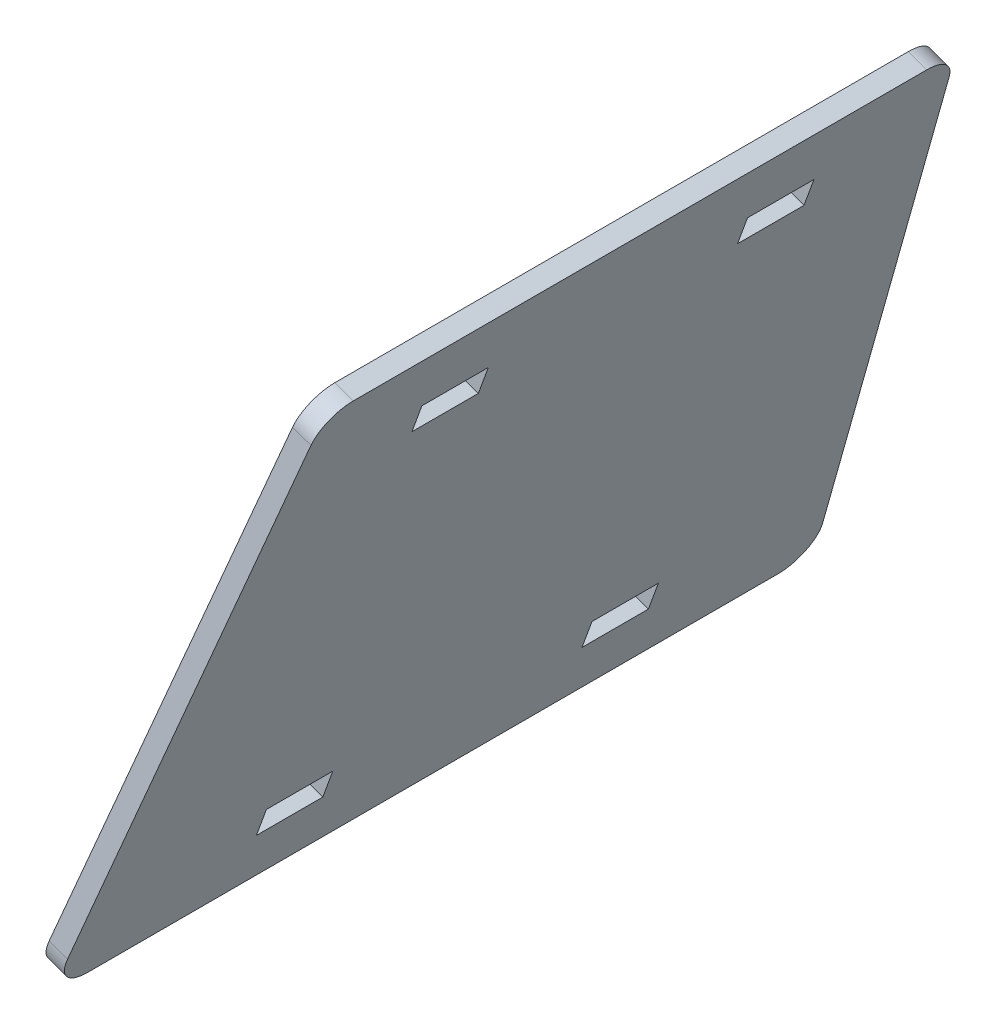
ISO-10303-21;
HEADER;
FILE_DESCRIPTION(('STEP AP214'),'2;1');
FILE_NAME('part.step','',(''),(''),'','','');
FILE_SCHEMA(('AUTOMOTIVE_DESIGN { 1 0 10303 214 1 1 1 1 }'));
ENDSEC;
DATA;
#1=APPLICATION_CONTEXT('core data for automotive mechanical design processes');
#2=APPLICATION_PROTOCOL_DEFINITION('international standard','automotive_design',2000,#1);
#3=PRODUCT_CONTEXT('',#1,'mechanical');
#4=PRODUCT('Part','Part','',(#3));
#5=PRODUCT_RELATED_PRODUCT_CATEGORY('part','',(#4));
#6=PRODUCT_DEFINITION_FORMATION('','',#4);
#7=PRODUCT_DEFINITION_CONTEXT('part definition',#1,'design');
#8=PRODUCT_DEFINITION('design','',#6,#7);
#9=PRODUCT_DEFINITION_SHAPE('','',#8);
#10=(LENGTH_UNIT() NAMED_UNIT(*) SI_UNIT(.MILLI.,.METRE.));
#11=(NAMED_UNIT(*) PLANE_ANGLE_UNIT() SI_UNIT($,.RADIAN.));
#12=(NAMED_UNIT(*) SI_UNIT($,.STERADIAN.) SOLID_ANGLE_UNIT());
#13=UNCERTAINTY_MEASURE_WITH_UNIT(LENGTH_MEASURE(1.E-05),#10,'distance_accuracy_value','');
#14=(GEOMETRIC_REPRESENTATION_CONTEXT(3) GLOBAL_UNCERTAINTY_ASSIGNED_CONTEXT((#13)) GLOBAL_UNIT_ASSIGNED_CONTEXT((#10,
#11,#12)) REPRESENTATION_CONTEXT('',''));
#15=CARTESIAN_POINT('',(0.,0.,0.));
#16=DIRECTION('',(0.,0.,1.));
#17=DIRECTION('',(1.,0.,0.));
#18=AXIS2_PLACEMENT_3D('',#15,#16,#17);
#19=CARTESIAN_POINT('',(-37.2681310039553,206.317493290376,-49.));
#20=DIRECTION('',(0.0367385989462375,0.100938471027188,-0.994214111956857));
#21=DIRECTION('',(0.,0.994885749576172,0.101006659633206));
#22=AXIS2_PLACEMENT_3D('',#19,#20,#21);
#23=PLANE('',#22);
#24=DIRECTION('',(0.340041253067883,0.934255664487075,0.107416477254837));
#25=VECTOR('',#24,1.);
#26=CARTESIAN_POINT('',(-65.3665086389558,216.544466380687,-49.));
#27=LINE('',#26,#25);
#28=CARTESIAN_POINT('',(-93.76563466198,138.518508900181,-57.9710705597843));
#29=VERTEX_POINT('',#28);
#30=CARTESIAN_POINT('',(-65.3665086389558,216.544466380687,-49.));
#31=VERTEX_POINT('',#30);
#32=EDGE_CURVE('E346',#29,#31,#27,.T.);
#33=ORIENTED_EDGE('',*,*,#32,.F.);
#34=DIRECTION('',(-0.93969262078591,0.342020143325665,0.));
#35=VECTOR('',#34,1.);
#36=CARTESIAN_POINT('',(-65.6672570269796,128.29153580987,-57.9710705597843));
#37=LINE('',#36,#35);
#38=CARTESIAN_POINT('',(-96.5847125243379,139.544569330158,-57.9710705597843));
#39=VERTEX_POINT('',#38);
#40=EDGE_CURVE('E361',#29,#39,#37,.T.);
#41=ORIENTED_EDGE('',*,*,#40,.T.);
#42=DIRECTION('',(-0.340041253067883,-0.934255664487075,-0.107416477254837));
#43=VECTOR('',#42,1.);
#44=CARTESIAN_POINT('',(-68.1855865013136,217.570526810664,-49.));
#45=LINE('',#44,#43);
#46=CARTESIAN_POINT('',(-68.1855865013136,217.570526810664,-49.));
#47=VERTEX_POINT('',#46);
#48=EDGE_CURVE('E333',#47,#39,#45,.T.);
#49=ORIENTED_EDGE('',*,*,#48,.F.);
#50=DIRECTION('',(-0.93969262078591,0.342020143325665,0.));
#51=VECTOR('',#50,1.);
#52=CARTESIAN_POINT('',(-37.2681310039553,206.317493290376,-49.));
#53=LINE('',#52,#51);
#54=EDGE_CURVE('E343',#31,#47,#53,.T.);
#55=ORIENTED_EDGE('',*,*,#54,.F.);
#56=EDGE_LOOP('',(#33,#41,#49,#55));
#57=FACE_BOUND('',#56,.T.);
#58=ADVANCED_FACE('F31',(#57),#23,.T.);
#59=CARTESIAN_POINT('',(-65.8509500217108,127.786843454734,-53.));
#60=DIRECTION('',(-0.93969262078591,0.342020143325665,0.));
#61=DIRECTION('',(-0.342020143325665,-0.93969262078591,0.));
#62=AXIS2_PLACEMENT_3D('',#59,#60,#61);
#63=CYLINDRICAL_SURFACE('',#62,5.);
#64=ORIENTED_EDGE('',*,*,#40,.F.);
#65=CARTESIAN_POINT('',(-93.9493276567112,138.013816545045,-53.));
#66=DIRECTION('',(-0.93969262078591,0.342020143325665,0.));
#67=DIRECTION('',(-0.342020143325665,-0.93969262078591,0.));
#68=AXIS2_PLACEMENT_3D('',#65,#66,#67);
#69=CIRCLE('',#68,5.);
#70=CARTESIAN_POINT('',(-95.6594283733396,133.315353441115,-53.));
#71=VERTEX_POINT('',#70);
#72=EDGE_CURVE('E321',#71,#29,#69,.F.);
#73=ORIENTED_EDGE('',*,*,#72,.F.);
#74=DIRECTION('',(-0.93969262078591,0.342020143325665,0.));
#75=VECTOR('',#74,1.);
#76=CARTESIAN_POINT('',(-67.5610507383391,123.088380350804,-53.));
#77=LINE('',#76,#75);
#78=CARTESIAN_POINT('',(-98.4785062356973,134.341413871092,-53.));
#79=VERTEX_POINT('',#78);
#80=EDGE_CURVE('E358',#71,#79,#77,.T.);
#81=ORIENTED_EDGE('',*,*,#80,.T.);
#82=CARTESIAN_POINT('',(-96.768405519069,139.039876975022,-53.));
#83=DIRECTION('',(-0.93969262078591,0.342020143325665,0.));
#84=DIRECTION('',(-0.342020143325665,-0.93969262078591,0.));
#85=AXIS2_PLACEMENT_3D('',#82,#83,#84);
#86=CIRCLE('',#85,5.);
#87=EDGE_CURVE('E335',#39,#79,#86,.T.);
#88=ORIENTED_EDGE('',*,*,#87,.F.);
#89=EDGE_LOOP('',(#64,#73,#81,#88));
#90=FACE_BOUND('',#89,.T.);
#91=ADVANCED_FACE('F384',(#90),#63,.T.);
#92=CARTESIAN_POINT('',(-37.4518239986865,205.81280093524,-44.0289294402157));
#93=DIRECTION('',(-0.93969262078591,0.342020143325665,0.));
#94=DIRECTION('',(-0.342020143325665,-0.93969262078591,0.));
#95=AXIS2_PLACEMENT_3D('',#92,#93,#94);
#96=CYLINDRICAL_SURFACE('',#95,4.99999999999998);
#97=CARTESIAN_POINT('',(-65.550201633687,216.039774025551,-44.0289294402157));
#98=DIRECTION('',(-0.93969262078591,0.342020143325665,0.));
#99=DIRECTION('',(-0.342020143325665,-0.93969262078591,0.));
#100=AXIS2_PLACEMENT_3D('',#97,#98,#99);
#101=CIRCLE('',#100,4.99999999999998);
#102=CARTESIAN_POINT('',(-63.8401009170587,220.738237129481,-44.0289294402157));
#103=VERTEX_POINT('',#102);
#104=EDGE_CURVE('E323',#31,#103,#101,.F.);
#105=ORIENTED_EDGE('',*,*,#104,.F.);
#106=ORIENTED_EDGE('',*,*,#54,.T.);
#107=CARTESIAN_POINT('',(-68.3692794960448,217.065834455528,-44.0289294402157));
#108=DIRECTION('',(-0.93969262078591,0.342020143325665,0.));
#109=DIRECTION('',(-0.342020143325665,-0.93969262078591,0.));
#110=AXIS2_PLACEMENT_3D('',#107,#108,#109);
#111=CIRCLE('',#110,4.99999999999998);
#112=CARTESIAN_POINT('',(-66.6591787794165,221.764297559458,-44.0289294402157));
#113=VERTEX_POINT('',#112);
#114=EDGE_CURVE('E331',#113,#47,#111,.T.);
#115=ORIENTED_EDGE('',*,*,#114,.F.);
#116=DIRECTION('',(-0.93969262078591,0.342020143325665,0.));
#117=VECTOR('',#116,1.);
#118=CARTESIAN_POINT('',(-35.7417232820582,210.51126403917,-44.0289294402157));
#119=LINE('',#118,#117);
#120=EDGE_CURVE('E344',#103,#113,#119,.T.);
#121=ORIENTED_EDGE('',*,*,#120,.F.);
#122=EDGE_LOOP('',(#105,#106,#115,#121));
#123=FACE_BOUND('',#122,.T.);
#124=ADVANCED_FACE('F394',(#123),#96,.T.);
#125=CARTESIAN_POINT('',(-66.6591787794165,221.764297559458,58.));
#126=DIRECTION('',(-0.342020143325667,-0.939692620785909,0.));
#127=DIRECTION('',(0.939692620785909,-0.342020143325667,0.));
#128=AXIS2_PLACEMENT_3D('',#125,#126,#127);
#129=PLANE('',#128);
#130=DIRECTION('',(0.,0.,-1.));
#131=VECTOR('',#130,1.);
#132=CARTESIAN_POINT('',(-63.8401009170587,220.738237129481,58.));
#133=LINE('',#132,#131);
#134=CARTESIAN_POINT('',(-63.8401009170587,220.738237129481,44.0289294402157));
#135=VERTEX_POINT('',#134);
#136=EDGE_CURVE('E367',#135,#103,#133,.T.);
#137=ORIENTED_EDGE('',*,*,#136,.T.);
#138=ORIENTED_EDGE('',*,*,#120,.T.);
#139=DIRECTION('',(0.,0.,-1.));
#140=VECTOR('',#139,1.);
#141=CARTESIAN_POINT('',(-66.6591787794165,221.764297559458,58.));
#142=LINE('',#141,#140);
#143=CARTESIAN_POINT('',(-66.6591787794165,221.764297559458,44.0289294402157));
#144=VERTEX_POINT('',#143);
#145=EDGE_CURVE('E11',#144,#113,#142,.T.);
#146=ORIENTED_EDGE('',*,*,#145,.F.);
#147=DIRECTION('',(-0.93969262078591,0.342020143325665,0.));
#148=VECTOR('',#147,1.);
#149=CARTESIAN_POINT('',(-35.7417232820582,210.51126403917,44.0289294402157));
#150=LINE('',#149,#148);
#151=EDGE_CURVE('E347',#135,#144,#150,.T.);
#152=ORIENTED_EDGE('',*,*,#151,.F.);
#153=EDGE_LOOP('',(#137,#138,#146,#152));
#154=FACE_BOUND('',#153,.T.);
#155=ADVANCED_FACE('F33',(#154),#129,.F.);
#156=CARTESIAN_POINT('',(-95.6594283733396,133.315353441115,58.));
#157=DIRECTION('',(0.342020143325657,0.939692620785913,0.));
#158=DIRECTION('',(-0.939692620785913,0.342020143325657,0.));
#159=AXIS2_PLACEMENT_3D('',#156,#157,#158);
#160=PLANE('',#159);
#161=DIRECTION('',(0.,0.,-1.));
#162=VECTOR('',#161,1.);
#163=CARTESIAN_POINT('',(-95.6594283733396,133.315353441115,58.));
#164=LINE('',#163,#162);
#165=CARTESIAN_POINT('',(-95.6594283733396,133.315353441115,53.));
#166=VERTEX_POINT('',#165);
#167=EDGE_CURVE('E370',#166,#71,#164,.T.);
#168=ORIENTED_EDGE('',*,*,#167,.F.);
#169=DIRECTION('',(-0.93969262078591,0.342020143325665,0.));
#170=VECTOR('',#169,1.);
#171=CARTESIAN_POINT('',(-67.5610507383391,123.088380350804,53.));
#172=LINE('',#171,#170);
#173=CARTESIAN_POINT('',(-98.4785062356973,134.341413871092,53.));
#174=VERTEX_POINT('',#173);
#175=EDGE_CURVE('E356',#166,#174,#172,.T.);
#176=ORIENTED_EDGE('',*,*,#175,.T.);
#177=DIRECTION('',(0.,0.,-1.));
#178=VECTOR('',#177,1.);
#179=CARTESIAN_POINT('',(-98.4785062356973,134.341413871092,58.));
#180=LINE('',#179,#178);
#181=EDGE_CURVE('E39',#174,#79,#180,.T.);
#182=ORIENTED_EDGE('',*,*,#181,.T.);
#183=ORIENTED_EDGE('',*,*,#80,.F.);
#184=EDGE_LOOP('',(#168,#176,#182,#183));
#185=FACE_BOUND('',#184,.T.);
#186=ADVANCED_FACE('F376',(#185),#160,.F.);
#187=CARTESIAN_POINT('',(-98.4785062356973,134.341413871092,58.));
#188=DIRECTION('',(0.93969262078591,-0.342020143325665,0.));
#189=DIRECTION('',(0.342020143325665,0.93969262078591,0.));
#190=AXIS2_PLACEMENT_3D('',#187,#188,#189);
#191=PLANE('',#190);
#192=DIRECTION('',(-0.342020143325665,-0.93969262078591,0.));
#193=VECTOR('',#192,1.);
#194=CARTESIAN_POINT('',(-93.9321920853096,146.83230934103,19.9));
#195=LINE('',#194,#193);
#196=CARTESIAN_POINT('',(-93.9321920853096,146.83230934103,19.9));
#197=VERTEX_POINT('',#196);
#198=CARTESIAN_POINT('',(-95.4659622718433,142.618310386896,19.9));
#199=VERTEX_POINT('',#198);
#200=EDGE_CURVE('E214',#197,#199,#195,.T.);
#201=ORIENTED_EDGE('',*,*,#200,.F.);
#202=DIRECTION('',(0.,0.,-1.));
#203=VECTOR('',#202,1.);
#204=CARTESIAN_POINT('',(-93.9321920853096,146.83230934103,30.1));
#205=LINE('',#204,#203);
#206=CARTESIAN_POINT('',(-93.9321920853096,146.83230934103,30.1));
#207=VERTEX_POINT('',#206);
#208=EDGE_CURVE('E46',#207,#197,#205,.T.);
#209=ORIENTED_EDGE('',*,*,#208,.F.);
#210=DIRECTION('',(0.342020143325665,0.93969262078591,0.));
#211=VECTOR('',#210,1.);
#212=CARTESIAN_POINT('',(-93.9321920853096,146.83230934103,30.1));
#213=LINE('',#212,#211);
#214=CARTESIAN_POINT('',(-95.4659622718433,142.618310386896,30.1));
#215=VERTEX_POINT('',#214);
#216=EDGE_CURVE('E200',#215,#207,#213,.T.);
#217=ORIENTED_EDGE('',*,*,#216,.F.);
#218=DIRECTION('',(0.,0.,1.));
#219=VECTOR('',#218,1.);
#220=CARTESIAN_POINT('',(-95.4659622718433,142.618310386896,30.1));
#221=LINE('',#220,#219);
#222=EDGE_CURVE('E220',#199,#215,#221,.T.);
#223=ORIENTED_EDGE('',*,*,#222,.F.);
#224=EDGE_LOOP('',(#201,#209,#217,#223));
#225=FACE_BOUND('',#224,.T.);
#226=DIRECTION('',(-0.342020143325665,-0.93969262078591,0.));
#227=VECTOR('',#226,1.);
#228=CARTESIAN_POINT('',(-70.0451781983406,212.461340613677,19.9));
#229=LINE('',#228,#227);
#230=CARTESIAN_POINT('',(-70.0451781983406,212.461340613677,19.9));
#231=VERTEX_POINT('',#230);
#232=CARTESIAN_POINT('',(-71.5789483848743,208.247341659543,19.9));
#233=VERTEX_POINT('',#232);
#234=EDGE_CURVE('E238',#231,#233,#229,.T.);
#235=ORIENTED_EDGE('',*,*,#234,.F.);
#236=DIRECTION('',(0.,0.,-1.));
#237=VECTOR('',#236,1.);
#238=CARTESIAN_POINT('',(-70.0451781983406,212.461340613677,30.1));
#239=LINE('',#238,#237);
#240=CARTESIAN_POINT('',(-70.0451781983406,212.461340613677,30.1));
#241=VERTEX_POINT('',#240);
#242=EDGE_CURVE('E236',#241,#231,#239,.T.);
#243=ORIENTED_EDGE('',*,*,#242,.F.);
#244=DIRECTION('',(0.342020143325665,0.93969262078591,0.));
#245=VECTOR('',#244,1.);
#246=CARTESIAN_POINT('',(-70.0451781983406,212.461340613677,30.1));
#247=LINE('',#246,#245);
#248=CARTESIAN_POINT('',(-71.5789483848743,208.247341659543,30.1));
#249=VERTEX_POINT('',#248);
#250=EDGE_CURVE('E244',#249,#241,#247,.T.);
#251=ORIENTED_EDGE('',*,*,#250,.F.);
#252=DIRECTION('',(0.,0.,1.));
#253=VECTOR('',#252,1.);
#254=CARTESIAN_POINT('',(-71.5789483848743,208.247341659543,30.1));
#255=LINE('',#254,#253);
#256=EDGE_CURVE('E241',#233,#249,#255,.T.);
#257=ORIENTED_EDGE('',*,*,#256,.F.);
#258=EDGE_LOOP('',(#235,#243,#251,#257));
#259=FACE_BOUND('',#258,.T.);
#260=DIRECTION('',(0.,0.,1.));
#261=VECTOR('',#260,1.);
#262=CARTESIAN_POINT('',(-95.4659622718433,142.618310386896,-30.1));
#263=LINE('',#262,#261);
#264=CARTESIAN_POINT('',(-95.4659622718433,142.618310386896,-30.1));
#265=VERTEX_POINT('',#264);
#266=CARTESIAN_POINT('',(-95.4659622718433,142.618310386896,-19.9));
#267=VERTEX_POINT('',#266);
#268=EDGE_CURVE('E269',#265,#267,#263,.T.);
#269=ORIENTED_EDGE('',*,*,#268,.F.);
#270=DIRECTION('',(-0.342020143325665,-0.93969262078591,0.));
#271=VECTOR('',#270,1.);
#272=CARTESIAN_POINT('',(-93.9321920853096,146.83230934103,-30.1));
#273=LINE('',#272,#271);
#274=CARTESIAN_POINT('',(-93.9321920853096,146.83230934103,-30.1));
#275=VERTEX_POINT('',#274);
#276=EDGE_CURVE('E267',#275,#265,#273,.T.);
#277=ORIENTED_EDGE('',*,*,#276,.F.);
#278=DIRECTION('',(0.,0.,-1.));
#279=VECTOR('',#278,1.);
#280=CARTESIAN_POINT('',(-93.9321920853096,146.83230934103,-30.1));
#281=LINE('',#280,#279);
#282=CARTESIAN_POINT('',(-93.9321920853096,146.83230934103,-19.9));
#283=VERTEX_POINT('',#282);
#284=EDGE_CURVE('E275',#283,#275,#281,.T.);
#285=ORIENTED_EDGE('',*,*,#284,.F.);
#286=DIRECTION('',(0.342020143325665,0.93969262078591,0.));
#287=VECTOR('',#286,1.);
#288=CARTESIAN_POINT('',(-93.9321920853096,146.83230934103,-19.9));
#289=LINE('',#288,#287);
#290=EDGE_CURVE('E272',#267,#283,#289,.T.);
#291=ORIENTED_EDGE('',*,*,#290,.F.);
#292=EDGE_LOOP('',(#269,#277,#285,#291));
#293=FACE_BOUND('',#292,.T.);
#294=DIRECTION('',(0.,0.,1.));
#295=VECTOR('',#294,1.);
#296=CARTESIAN_POINT('',(-71.5789483848743,208.247341659543,-30.1));
#297=LINE('',#296,#295);
#298=CARTESIAN_POINT('',(-71.5789483848743,208.247341659543,-30.1));
#299=VERTEX_POINT('',#298);
#300=CARTESIAN_POINT('',(-71.5789483848743,208.247341659543,-19.9));
#301=VERTEX_POINT('',#300);
#302=EDGE_CURVE('E300',#299,#301,#297,.T.);
#303=ORIENTED_EDGE('',*,*,#302,.F.);
#304=DIRECTION('',(-0.342020143325665,-0.93969262078591,0.));
#305=VECTOR('',#304,1.);
#306=CARTESIAN_POINT('',(-70.0451781983406,212.461340613677,-30.1));
#307=LINE('',#306,#305);
#308=CARTESIAN_POINT('',(-70.0451781983406,212.461340613677,-30.1));
#309=VERTEX_POINT('',#308);
#310=EDGE_CURVE('E298',#309,#299,#307,.T.);
#311=ORIENTED_EDGE('',*,*,#310,.F.);
#312=DIRECTION('',(0.,0.,-1.));
#313=VECTOR('',#312,1.);
#314=CARTESIAN_POINT('',(-70.0451781983406,212.461340613677,-30.1));
#315=LINE('',#314,#313);
#316=CARTESIAN_POINT('',(-70.0451781983406,212.461340613677,-19.9));
#317=VERTEX_POINT('',#316);
#318=EDGE_CURVE('E306',#317,#309,#315,.T.);
#319=ORIENTED_EDGE('',*,*,#318,.F.);
#320=DIRECTION('',(0.342020143325665,0.93969262078591,0.));
#321=VECTOR('',#320,1.);
#322=CARTESIAN_POINT('',(-70.0451781983406,212.461340613677,-19.9));
#323=LINE('',#322,#321);
#324=EDGE_CURVE('E303',#301,#317,#323,.T.);
#325=ORIENTED_EDGE('',*,*,#324,.F.);
#326=EDGE_LOOP('',(#303,#311,#319,#325));
#327=FACE_BOUND('',#326,.T.);
#328=CARTESIAN_POINT('',(-68.3692794960448,217.065834455528,44.0289294402157));
#329=DIRECTION('',(-0.93969262078591,0.342020143325665,0.));
#330=DIRECTION('',(-0.342020143325665,-0.93969262078591,0.));
#331=AXIS2_PLACEMENT_3D('',#328,#329,#330);
#332=CIRCLE('',#331,4.99999999999998);
#333=CARTESIAN_POINT('',(-68.1855865013136,217.570526810664,49.));
#334=VERTEX_POINT('',#333);
#335=EDGE_CURVE('E341',#334,#144,#332,.T.);
#336=ORIENTED_EDGE('',*,*,#335,.T.);
#337=ORIENTED_EDGE('',*,*,#145,.T.);
#338=ORIENTED_EDGE('',*,*,#114,.T.);
#339=ORIENTED_EDGE('',*,*,#48,.T.);
#340=ORIENTED_EDGE('',*,*,#87,.T.);
#341=ORIENTED_EDGE('',*,*,#181,.F.);
#342=CARTESIAN_POINT('',(-96.768405519069,139.039876975022,53.));
#343=DIRECTION('',(-0.93969262078591,0.342020143325665,0.));
#344=DIRECTION('',(0.342020143325665,0.93969262078591,0.));
#345=AXIS2_PLACEMENT_3D('',#342,#343,#344);
#346=CIRCLE('',#345,5.);
#347=CARTESIAN_POINT('',(-96.5847125243378,139.544569330158,57.9710705597843));
#348=VERTEX_POINT('',#347);
#349=EDGE_CURVE('E337',#174,#348,#346,.T.);
#350=ORIENTED_EDGE('',*,*,#349,.T.);
#351=DIRECTION('',(0.340041253067883,0.934255664487075,-0.107416477254837));
#352=VECTOR('',#351,1.);
#353=CARTESIAN_POINT('',(-68.1855865013136,217.570526810664,49.));
#354=LINE('',#353,#352);
#355=EDGE_CURVE('E339',#348,#334,#354,.T.);
#356=ORIENTED_EDGE('',*,*,#355,.T.);
#357=EDGE_LOOP('',(#336,#337,#338,#339,#340,#341,#350,#356));
#358=FACE_BOUND('',#357,.T.);
#359=ADVANCED_FACE('F411',(#225,#259,#293,#327,#358),#191,.F.);
#360=CARTESIAN_POINT('',(-63.8401009170587,220.738237129481,58.));
#361=DIRECTION('',(-0.93969262078591,0.342020143325665,0.));
#362=DIRECTION('',(-0.342020143325665,-0.93969262078591,0.));
#363=AXIS2_PLACEMENT_3D('',#360,#361,#362);
#364=PLANE('',#363);
#365=DIRECTION('',(-0.342020143325665,-0.93969262078591,0.));
#366=VECTOR('',#365,1.);
#367=CARTESIAN_POINT('',(-91.1131142229518,145.806248911053,30.1));
#368=LINE('',#367,#366);
#369=CARTESIAN_POINT('',(-91.1131142229518,145.806248911053,30.1));
#370=VERTEX_POINT('',#369);
#371=CARTESIAN_POINT('',(-92.6468844094855,141.592249956919,30.1));
#372=VERTEX_POINT('',#371);
#373=EDGE_CURVE('E212',#370,#372,#368,.T.);
#374=ORIENTED_EDGE('',*,*,#373,.F.);
#375=DIRECTION('',(0.,0.,1.));
#376=VECTOR('',#375,1.);
#377=CARTESIAN_POINT('',(-91.1131142229518,145.806248911053,30.1));
#378=LINE('',#377,#376);
#379=CARTESIAN_POINT('',(-91.1131142229518,145.806248911053,19.9));
#380=VERTEX_POINT('',#379);
#381=EDGE_CURVE('E194',#380,#370,#378,.T.);
#382=ORIENTED_EDGE('',*,*,#381,.F.);
#383=DIRECTION('',(0.342020143325665,0.93969262078591,0.));
#384=VECTOR('',#383,1.);
#385=CARTESIAN_POINT('',(-91.1131142229518,145.806248911053,19.9));
#386=LINE('',#385,#384);
#387=CARTESIAN_POINT('',(-92.6468844094855,141.592249956919,19.9));
#388=VERTEX_POINT('',#387);
#389=EDGE_CURVE('E203',#388,#380,#386,.T.);
#390=ORIENTED_EDGE('',*,*,#389,.F.);
#391=DIRECTION('',(0.,0.,-1.));
#392=VECTOR('',#391,1.);
#393=CARTESIAN_POINT('',(-92.6468844094855,141.592249956919,30.1));
#394=LINE('',#393,#392);
#395=EDGE_CURVE('E54',#372,#388,#394,.T.);
#396=ORIENTED_EDGE('',*,*,#395,.F.);
#397=EDGE_LOOP('',(#374,#382,#390,#396));
#398=FACE_BOUND('',#397,.T.);
#399=DIRECTION('',(-0.342020143325665,-0.93969262078591,0.));
#400=VECTOR('',#399,1.);
#401=CARTESIAN_POINT('',(-67.2261003359828,211.4352801837,30.1));
#402=LINE('',#401,#400);
#403=CARTESIAN_POINT('',(-67.2261003359828,211.4352801837,30.1));
#404=VERTEX_POINT('',#403);
#405=CARTESIAN_POINT('',(-68.7598705225165,207.221281229566,30.1));
#406=VERTEX_POINT('',#405);
#407=EDGE_CURVE('E230',#404,#406,#402,.T.);
#408=ORIENTED_EDGE('',*,*,#407,.F.);
#409=DIRECTION('',(0.,0.,1.));
#410=VECTOR('',#409,1.);
#411=CARTESIAN_POINT('',(-67.2261003359828,211.4352801837,30.1));
#412=LINE('',#411,#410);
#413=CARTESIAN_POINT('',(-67.2261003359828,211.4352801837,19.9));
#414=VERTEX_POINT('',#413);
#415=EDGE_CURVE('E233',#414,#404,#412,.T.);
#416=ORIENTED_EDGE('',*,*,#415,.F.);
#417=DIRECTION('',(0.342020143325665,0.93969262078591,0.));
#418=VECTOR('',#417,1.);
#419=CARTESIAN_POINT('',(-67.2261003359828,211.4352801837,19.9));
#420=LINE('',#419,#418);
#421=CARTESIAN_POINT('',(-68.7598705225165,207.221281229566,19.9));
#422=VERTEX_POINT('',#421);
#423=EDGE_CURVE('E250',#422,#414,#420,.T.);
#424=ORIENTED_EDGE('',*,*,#423,.F.);
#425=DIRECTION('',(0.,0.,-1.));
#426=VECTOR('',#425,1.);
#427=CARTESIAN_POINT('',(-68.7598705225165,207.221281229566,30.1));
#428=LINE('',#427,#426);
#429=EDGE_CURVE('E206',#406,#422,#428,.T.);
#430=ORIENTED_EDGE('',*,*,#429,.F.);
#431=EDGE_LOOP('',(#408,#416,#424,#430));
#432=FACE_BOUND('',#431,.T.);
#433=DIRECTION('',(0.,0.,1.));
#434=VECTOR('',#433,1.);
#435=CARTESIAN_POINT('',(-91.1131142229518,145.806248911053,-30.1));
#436=LINE('',#435,#434);
#437=CARTESIAN_POINT('',(-91.1131142229518,145.806248911053,-30.1));
#438=VERTEX_POINT('',#437);
#439=CARTESIAN_POINT('',(-91.1131142229518,145.806248911053,-19.9));
#440=VERTEX_POINT('',#439);
#441=EDGE_CURVE('E261',#438,#440,#436,.T.);
#442=ORIENTED_EDGE('',*,*,#441,.F.);
#443=DIRECTION('',(0.342020143325665,0.93969262078591,0.));
#444=VECTOR('',#443,1.);
#445=CARTESIAN_POINT('',(-91.1131142229518,145.806248911053,-30.1));
#446=LINE('',#445,#444);
#447=CARTESIAN_POINT('',(-92.6468844094855,141.592249956919,-30.1));
#448=VERTEX_POINT('',#447);
#449=EDGE_CURVE('E264',#448,#438,#446,.T.);
#450=ORIENTED_EDGE('',*,*,#449,.F.);
#451=DIRECTION('',(0.,0.,-1.));
#452=VECTOR('',#451,1.);
#453=CARTESIAN_POINT('',(-92.6468844094855,141.592249956919,-30.1));
#454=LINE('',#453,#452);
#455=CARTESIAN_POINT('',(-92.6468844094855,141.592249956919,-19.9));
#456=VERTEX_POINT('',#455);
#457=EDGE_CURVE('E281',#456,#448,#454,.T.);
#458=ORIENTED_EDGE('',*,*,#457,.F.);
#459=DIRECTION('',(-0.342020143325665,-0.93969262078591,0.));
#460=VECTOR('',#459,1.);
#461=CARTESIAN_POINT('',(-91.1131142229518,145.806248911053,-19.9));
#462=LINE('',#461,#460);
#463=EDGE_CURVE('E259',#440,#456,#462,.T.);
#464=ORIENTED_EDGE('',*,*,#463,.F.);
#465=EDGE_LOOP('',(#442,#450,#458,#464));
#466=FACE_BOUND('',#465,.T.);
#467=DIRECTION('',(0.,0.,1.));
#468=VECTOR('',#467,1.);
#469=CARTESIAN_POINT('',(-67.2261003359828,211.4352801837,-30.1));
#470=LINE('',#469,#468);
#471=CARTESIAN_POINT('',(-67.2261003359828,211.4352801837,-30.1));
#472=VERTEX_POINT('',#471);
#473=CARTESIAN_POINT('',(-67.2261003359828,211.4352801837,-19.9));
#474=VERTEX_POINT('',#473);
#475=EDGE_CURVE('E292',#472,#474,#470,.T.);
#476=ORIENTED_EDGE('',*,*,#475,.F.);
#477=DIRECTION('',(0.342020143325665,0.93969262078591,0.));
#478=VECTOR('',#477,1.);
#479=CARTESIAN_POINT('',(-67.2261003359828,211.4352801837,-30.1));
#480=LINE('',#479,#478);
#481=CARTESIAN_POINT('',(-68.7598705225165,207.221281229566,-30.1));
#482=VERTEX_POINT('',#481);
#483=EDGE_CURVE('E295',#482,#472,#480,.T.);
#484=ORIENTED_EDGE('',*,*,#483,.F.);
#485=DIRECTION('',(0.,0.,-1.));
#486=VECTOR('',#485,1.);
#487=CARTESIAN_POINT('',(-68.7598705225165,207.221281229566,-30.1));
#488=LINE('',#487,#486);
#489=CARTESIAN_POINT('',(-68.7598705225165,207.221281229566,-19.9));
#490=VERTEX_POINT('',#489);
#491=EDGE_CURVE('E312',#490,#482,#488,.T.);
#492=ORIENTED_EDGE('',*,*,#491,.F.);
#493=DIRECTION('',(-0.342020143325665,-0.93969262078591,0.));
#494=VECTOR('',#493,1.);
#495=CARTESIAN_POINT('',(-67.2261003359828,211.4352801837,-19.9));
#496=LINE('',#495,#494);
#497=EDGE_CURVE('E290',#474,#490,#496,.T.);
#498=ORIENTED_EDGE('',*,*,#497,.F.);
#499=EDGE_LOOP('',(#476,#484,#492,#498));
#500=FACE_BOUND('',#499,.T.);
#501=CARTESIAN_POINT('',(-65.550201633687,216.039774025551,44.0289294402157));
#502=DIRECTION('',(-0.93969262078591,0.342020143325665,0.));
#503=DIRECTION('',(-0.342020143325665,-0.93969262078591,0.));
#504=AXIS2_PLACEMENT_3D('',#501,#502,#503);
#505=CIRCLE('',#504,4.99999999999998);
#506=CARTESIAN_POINT('',(-65.3665086389558,216.544466380687,49.));
#507=VERTEX_POINT('',#506);
#508=EDGE_CURVE('E329',#135,#507,#505,.F.);
#509=ORIENTED_EDGE('',*,*,#508,.T.);
#510=DIRECTION('',(-0.340041253067883,-0.934255664487075,0.107416477254837));
#511=VECTOR('',#510,1.);
#512=CARTESIAN_POINT('',(-65.3665086389558,216.544466380687,49.));
#513=LINE('',#512,#511);
#514=CARTESIAN_POINT('',(-93.76563466198,138.518508900181,57.9710705597843));
#515=VERTEX_POINT('',#514);
#516=EDGE_CURVE('E327',#507,#515,#513,.T.);
#517=ORIENTED_EDGE('',*,*,#516,.T.);
#518=CARTESIAN_POINT('',(-93.9493276567112,138.013816545045,53.));
#519=DIRECTION('',(-0.93969262078591,0.342020143325665,0.));
#520=DIRECTION('',(-0.342020143325665,-0.93969262078591,0.));
#521=AXIS2_PLACEMENT_3D('',#518,#519,#520);
#522=CIRCLE('',#521,5.);
#523=EDGE_CURVE('E325',#515,#166,#522,.F.);
#524=ORIENTED_EDGE('',*,*,#523,.T.);
#525=ORIENTED_EDGE('',*,*,#167,.T.);
#526=ORIENTED_EDGE('',*,*,#72,.T.);
#527=ORIENTED_EDGE('',*,*,#32,.T.);
#528=ORIENTED_EDGE('',*,*,#104,.T.);
#529=ORIENTED_EDGE('',*,*,#136,.F.);
#530=EDGE_LOOP('',(#509,#517,#524,#525,#526,#527,#528,#529));
#531=FACE_BOUND('',#530,.T.);
#532=ADVANCED_FACE('F209',(#398,#432,#466,#500,#531),#364,.F.);
#533=CARTESIAN_POINT('',(-65.8509500217108,127.786843454734,53.));
#534=DIRECTION('',(-0.93969262078591,0.342020143325665,0.));
#535=DIRECTION('',(-0.342020143325665,-0.93969262078591,0.));
#536=AXIS2_PLACEMENT_3D('',#533,#534,#535);
#537=CYLINDRICAL_SURFACE('',#536,5.);
#538=ORIENTED_EDGE('',*,*,#175,.F.);
#539=ORIENTED_EDGE('',*,*,#523,.F.);
#540=DIRECTION('',(-0.93969262078591,0.342020143325665,0.));
#541=VECTOR('',#540,1.);
#542=CARTESIAN_POINT('',(-65.6672570269796,128.29153580987,57.9710705597843));
#543=LINE('',#542,#541);
#544=EDGE_CURVE('E353',#515,#348,#543,.T.);
#545=ORIENTED_EDGE('',*,*,#544,.T.);
#546=ORIENTED_EDGE('',*,*,#349,.F.);
#547=EDGE_LOOP('',(#538,#539,#545,#546));
#548=FACE_BOUND('',#547,.T.);
#549=ADVANCED_FACE('F410',(#548),#537,.T.);
#550=CARTESIAN_POINT('',(-37.4518239986865,205.81280093524,44.0289294402157));
#551=DIRECTION('',(-0.93969262078591,0.342020143325665,0.));
#552=DIRECTION('',(-0.342020143325665,-0.93969262078591,0.));
#553=AXIS2_PLACEMENT_3D('',#550,#551,#552);
#554=CYLINDRICAL_SURFACE('',#553,4.99999999999998);
#555=ORIENTED_EDGE('',*,*,#508,.F.);
#556=ORIENTED_EDGE('',*,*,#151,.T.);
#557=ORIENTED_EDGE('',*,*,#335,.F.);
#558=DIRECTION('',(-0.93969262078591,0.342020143325665,0.));
#559=VECTOR('',#558,1.);
#560=CARTESIAN_POINT('',(-37.2681310039553,206.317493290376,49.));
#561=LINE('',#560,#559);
#562=EDGE_CURVE('E350',#507,#334,#561,.T.);
#563=ORIENTED_EDGE('',*,*,#562,.F.);
#564=EDGE_LOOP('',(#555,#556,#557,#563));
#565=FACE_BOUND('',#564,.T.);
#566=ADVANCED_FACE('F401',(#565),#554,.T.);
#567=CARTESIAN_POINT('',(-37.2681310039553,206.317493290376,49.));
#568=DIRECTION('',(0.0367385989462375,0.100938471027188,0.994214111956857));
#569=DIRECTION('',(0.,-0.994885749576172,0.101006659633206));
#570=AXIS2_PLACEMENT_3D('',#567,#568,#569);
#571=PLANE('',#570);
#572=ORIENTED_EDGE('',*,*,#516,.F.);
#573=ORIENTED_EDGE('',*,*,#562,.T.);
#574=ORIENTED_EDGE('',*,*,#355,.F.);
#575=ORIENTED_EDGE('',*,*,#544,.F.);
#576=EDGE_LOOP('',(#572,#573,#574,#575));
#577=FACE_BOUND('',#576,.T.);
#578=ADVANCED_FACE('F407',(#577),#571,.T.);
#579=CARTESIAN_POINT('',(-39.1277227009823,201.208307093389,-30.1));
#580=DIRECTION('',(0.,0.,-1.));
#581=DIRECTION('',(-1.,0.,0.));
#582=AXIS2_PLACEMENT_3D('',#579,#580,#581);
#583=PLANE('',#582);
#584=ORIENTED_EDGE('',*,*,#483,.T.);
#585=DIRECTION('',(-0.93969262078591,0.342020143325665,0.));
#586=VECTOR('',#585,1.);
#587=CARTESIAN_POINT('',(-39.1277227009823,201.208307093389,-30.1));
#588=LINE('',#587,#586);
#589=EDGE_CURVE('E310',#472,#309,#588,.T.);
#590=ORIENTED_EDGE('',*,*,#589,.T.);
#591=ORIENTED_EDGE('',*,*,#310,.T.);
#592=DIRECTION('',(-0.93969262078591,0.342020143325665,0.));
#593=VECTOR('',#592,1.);
#594=CARTESIAN_POINT('',(-40.661492887516,196.994308139255,-30.1));
#595=LINE('',#594,#593);
#596=EDGE_CURVE('E309',#482,#299,#595,.T.);
#597=ORIENTED_EDGE('',*,*,#596,.F.);
#598=EDGE_LOOP('',(#584,#590,#591,#597));
#599=FACE_BOUND('',#598,.T.);
#600=ADVANCED_FACE('F464',(#599),#583,.F.);
#601=CARTESIAN_POINT('',(-39.1277227009823,201.208307093389,-30.1));
#602=DIRECTION('',(0.342020143325665,0.93969262078591,0.));
#603=DIRECTION('',(-0.93969262078591,0.342020143325665,0.));
#604=AXIS2_PLACEMENT_3D('',#601,#602,#603);
#605=PLANE('',#604);
#606=ORIENTED_EDGE('',*,*,#475,.T.);
#607=DIRECTION('',(-0.93969262078591,0.342020143325665,0.));
#608=VECTOR('',#607,1.);
#609=CARTESIAN_POINT('',(-39.1277227009823,201.208307093389,-19.9));
#610=LINE('',#609,#608);
#611=EDGE_CURVE('E313',#474,#317,#610,.T.);
#612=ORIENTED_EDGE('',*,*,#611,.T.);
#613=ORIENTED_EDGE('',*,*,#318,.T.);
#614=ORIENTED_EDGE('',*,*,#589,.F.);
#615=EDGE_LOOP('',(#606,#612,#613,#614));
#616=FACE_BOUND('',#615,.T.);
#617=ADVANCED_FACE('F483',(#616),#605,.F.);
#618=CARTESIAN_POINT('',(-39.1277227009823,201.208307093389,-19.9));
#619=DIRECTION('',(0.,0.,1.));
#620=DIRECTION('',(1.,0.,0.));
#621=AXIS2_PLACEMENT_3D('',#618,#619,#620);
#622=PLANE('',#621);
#623=ORIENTED_EDGE('',*,*,#497,.T.);
#624=DIRECTION('',(-0.93969262078591,0.342020143325665,0.));
#625=VECTOR('',#624,1.);
#626=CARTESIAN_POINT('',(-40.661492887516,196.994308139255,-19.9));
#627=LINE('',#626,#625);
#628=EDGE_CURVE('E315',#490,#301,#627,.T.);
#629=ORIENTED_EDGE('',*,*,#628,.T.);
#630=ORIENTED_EDGE('',*,*,#324,.T.);
#631=ORIENTED_EDGE('',*,*,#611,.F.);
#632=EDGE_LOOP('',(#623,#629,#630,#631));
#633=FACE_BOUND('',#632,.T.);
#634=ADVANCED_FACE('F493',(#633),#622,.F.);
#635=CARTESIAN_POINT('',(-40.661492887516,196.994308139255,-30.1));
#636=DIRECTION('',(-0.342020143325665,-0.93969262078591,0.));
#637=DIRECTION('',(0.93969262078591,-0.342020143325665,0.));
#638=AXIS2_PLACEMENT_3D('',#635,#636,#637);
#639=PLANE('',#638);
#640=ORIENTED_EDGE('',*,*,#491,.T.);
#641=ORIENTED_EDGE('',*,*,#596,.T.);
#642=ORIENTED_EDGE('',*,*,#302,.T.);
#643=ORIENTED_EDGE('',*,*,#628,.F.);
#644=EDGE_LOOP('',(#640,#641,#642,#643));
#645=FACE_BOUND('',#644,.T.);
#646=ADVANCED_FACE('F503',(#645),#639,.F.);
#647=CARTESIAN_POINT('',(-63.0147365879513,135.579275820742,-30.1));
#648=DIRECTION('',(0.,0.,-1.));
#649=DIRECTION('',(-1.,0.,0.));
#650=AXIS2_PLACEMENT_3D('',#647,#648,#649);
#651=PLANE('',#650);
#652=ORIENTED_EDGE('',*,*,#449,.T.);
#653=DIRECTION('',(-0.93969262078591,0.342020143325665,0.));
#654=VECTOR('',#653,1.);
#655=CARTESIAN_POINT('',(-63.0147365879513,135.579275820742,-30.1));
#656=LINE('',#655,#654);
#657=EDGE_CURVE('E279',#438,#275,#656,.T.);
#658=ORIENTED_EDGE('',*,*,#657,.T.);
#659=ORIENTED_EDGE('',*,*,#276,.T.);
#660=DIRECTION('',(-0.93969262078591,0.342020143325665,0.));
#661=VECTOR('',#660,1.);
#662=CARTESIAN_POINT('',(-64.548506774485,131.365276866608,-30.1));
#663=LINE('',#662,#661);
#664=EDGE_CURVE('E278',#448,#265,#663,.T.);
#665=ORIENTED_EDGE('',*,*,#664,.F.);
#666=EDGE_LOOP('',(#652,#658,#659,#665));
#667=FACE_BOUND('',#666,.T.);
#668=ADVANCED_FACE('F513',(#667),#651,.F.);
#669=CARTESIAN_POINT('',(-63.0147365879513,135.579275820742,-30.1));
#670=DIRECTION('',(0.342020143325665,0.93969262078591,0.));
#671=DIRECTION('',(-0.93969262078591,0.342020143325665,0.));
#672=AXIS2_PLACEMENT_3D('',#669,#670,#671);
#673=PLANE('',#672);
#674=ORIENTED_EDGE('',*,*,#441,.T.);
#675=DIRECTION('',(-0.93969262078591,0.342020143325665,0.));
#676=VECTOR('',#675,1.);
#677=CARTESIAN_POINT('',(-63.0147365879513,135.579275820742,-19.9));
#678=LINE('',#677,#676);
#679=EDGE_CURVE('E282',#440,#283,#678,.T.);
#680=ORIENTED_EDGE('',*,*,#679,.T.);
#681=ORIENTED_EDGE('',*,*,#284,.T.);
#682=ORIENTED_EDGE('',*,*,#657,.F.);
#683=EDGE_LOOP('',(#674,#680,#681,#682));
#684=FACE_BOUND('',#683,.T.);
#685=ADVANCED_FACE('F523',(#684),#673,.F.);
#686=CARTESIAN_POINT('',(-63.0147365879513,135.579275820742,-19.9));
#687=DIRECTION('',(0.,0.,1.));
#688=DIRECTION('',(1.,0.,0.));
#689=AXIS2_PLACEMENT_3D('',#686,#687,#688);
#690=PLANE('',#689);
#691=ORIENTED_EDGE('',*,*,#463,.T.);
#692=DIRECTION('',(-0.93969262078591,0.342020143325665,0.));
#693=VECTOR('',#692,1.);
#694=CARTESIAN_POINT('',(-64.548506774485,131.365276866608,-19.9));
#695=LINE('',#694,#693);
#696=EDGE_CURVE('E284',#456,#267,#695,.T.);
#697=ORIENTED_EDGE('',*,*,#696,.T.);
#698=ORIENTED_EDGE('',*,*,#290,.T.);
#699=ORIENTED_EDGE('',*,*,#679,.F.);
#700=EDGE_LOOP('',(#691,#697,#698,#699));
#701=FACE_BOUND('',#700,.T.);
#702=ADVANCED_FACE('F533',(#701),#690,.F.);
#703=CARTESIAN_POINT('',(-64.548506774485,131.365276866608,-30.1));
#704=DIRECTION('',(-0.342020143325665,-0.93969262078591,0.));
#705=DIRECTION('',(0.93969262078591,-0.342020143325665,0.));
#706=AXIS2_PLACEMENT_3D('',#703,#704,#705);
#707=PLANE('',#706);
#708=ORIENTED_EDGE('',*,*,#457,.T.);
#709=ORIENTED_EDGE('',*,*,#664,.T.);
#710=ORIENTED_EDGE('',*,*,#268,.T.);
#711=ORIENTED_EDGE('',*,*,#696,.F.);
#712=EDGE_LOOP('',(#708,#709,#710,#711));
#713=FACE_BOUND('',#712,.T.);
#714=ADVANCED_FACE('F543',(#713),#707,.F.);
#715=CARTESIAN_POINT('',(-39.1277227009823,201.208307093389,30.1));
#716=DIRECTION('',(0.342020143325665,0.93969262078591,0.));
#717=DIRECTION('',(-0.93969262078591,0.342020143325665,0.));
#718=AXIS2_PLACEMENT_3D('',#715,#716,#717);
#719=PLANE('',#718);
#720=ORIENTED_EDGE('',*,*,#415,.T.);
#721=DIRECTION('',(-0.93969262078591,0.342020143325665,0.));
#722=VECTOR('',#721,1.);
#723=CARTESIAN_POINT('',(-39.1277227009823,201.208307093389,30.1));
#724=LINE('',#723,#722);
#725=EDGE_CURVE('E248',#404,#241,#724,.T.);
#726=ORIENTED_EDGE('',*,*,#725,.T.);
#727=ORIENTED_EDGE('',*,*,#242,.T.);
#728=DIRECTION('',(-0.93969262078591,0.342020143325665,0.));
#729=VECTOR('',#728,1.);
#730=CARTESIAN_POINT('',(-39.1277227009823,201.208307093389,19.9));
#731=LINE('',#730,#729);
#732=EDGE_CURVE('E247',#414,#231,#731,.T.);
#733=ORIENTED_EDGE('',*,*,#732,.F.);
#734=EDGE_LOOP('',(#720,#726,#727,#733));
#735=FACE_BOUND('',#734,.T.);
#736=ADVANCED_FACE('F553',(#735),#719,.F.);
#737=CARTESIAN_POINT('',(-39.1277227009823,201.208307093389,30.1));
#738=DIRECTION('',(0.,0.,1.));
#739=DIRECTION('',(1.,0.,0.));
#740=AXIS2_PLACEMENT_3D('',#737,#738,#739);
#741=PLANE('',#740);
#742=ORIENTED_EDGE('',*,*,#407,.T.);
#743=DIRECTION('',(-0.93969262078591,0.342020143325665,0.));
#744=VECTOR('',#743,1.);
#745=CARTESIAN_POINT('',(-40.661492887516,196.994308139255,30.1));
#746=LINE('',#745,#744);
#747=EDGE_CURVE('E251',#406,#249,#746,.T.);
#748=ORIENTED_EDGE('',*,*,#747,.T.);
#749=ORIENTED_EDGE('',*,*,#250,.T.);
#750=ORIENTED_EDGE('',*,*,#725,.F.);
#751=EDGE_LOOP('',(#742,#748,#749,#750));
#752=FACE_BOUND('',#751,.T.);
#753=ADVANCED_FACE('F563',(#752),#741,.F.);
#754=CARTESIAN_POINT('',(-40.661492887516,196.994308139255,30.1));
#755=DIRECTION('',(-0.342020143325665,-0.93969262078591,0.));
#756=DIRECTION('',(0.93969262078591,-0.342020143325665,0.));
#757=AXIS2_PLACEMENT_3D('',#754,#755,#756);
#758=PLANE('',#757);
#759=ORIENTED_EDGE('',*,*,#429,.T.);
#760=DIRECTION('',(-0.93969262078591,0.342020143325665,0.));
#761=VECTOR('',#760,1.);
#762=CARTESIAN_POINT('',(-40.661492887516,196.994308139255,19.9));
#763=LINE('',#762,#761);
#764=EDGE_CURVE('E253',#422,#233,#763,.T.);
#765=ORIENTED_EDGE('',*,*,#764,.T.);
#766=ORIENTED_EDGE('',*,*,#256,.T.);
#767=ORIENTED_EDGE('',*,*,#747,.F.);
#768=EDGE_LOOP('',(#759,#765,#766,#767));
#769=FACE_BOUND('',#768,.T.);
#770=ADVANCED_FACE('F573',(#769),#758,.F.);
#771=CARTESIAN_POINT('',(-39.1277227009823,201.208307093389,19.9));
#772=DIRECTION('',(0.,0.,-1.));
#773=DIRECTION('',(-1.,0.,0.));
#774=AXIS2_PLACEMENT_3D('',#771,#772,#773);
#775=PLANE('',#774);
#776=ORIENTED_EDGE('',*,*,#423,.T.);
#777=ORIENTED_EDGE('',*,*,#732,.T.);
#778=ORIENTED_EDGE('',*,*,#234,.T.);
#779=ORIENTED_EDGE('',*,*,#764,.F.);
#780=EDGE_LOOP('',(#776,#777,#778,#779));
#781=FACE_BOUND('',#780,.T.);
#782=ADVANCED_FACE('F583',(#781),#775,.F.);
#783=CARTESIAN_POINT('',(-63.0147365879513,135.579275820742,30.1));
#784=DIRECTION('',(0.342020143325665,0.93969262078591,0.));
#785=DIRECTION('',(-0.93969262078591,0.342020143325665,0.));
#786=AXIS2_PLACEMENT_3D('',#783,#784,#785);
#787=PLANE('',#786);
#788=ORIENTED_EDGE('',*,*,#381,.T.);
#789=DIRECTION('',(-0.93969262078591,0.342020143325665,0.));
#790=VECTOR('',#789,1.);
#791=CARTESIAN_POINT('',(-63.0147365879513,135.579275820742,30.1));
#792=LINE('',#791,#790);
#793=EDGE_CURVE('E207',#370,#207,#792,.T.);
#794=ORIENTED_EDGE('',*,*,#793,.T.);
#795=ORIENTED_EDGE('',*,*,#208,.T.);
#796=DIRECTION('',(-0.93969262078591,0.342020143325665,0.));
#797=VECTOR('',#796,1.);
#798=CARTESIAN_POINT('',(-63.0147365879513,135.579275820742,19.9));
#799=LINE('',#798,#797);
#800=EDGE_CURVE('E190',#380,#197,#799,.T.);
#801=ORIENTED_EDGE('',*,*,#800,.F.);
#802=EDGE_LOOP('',(#788,#794,#795,#801));
#803=FACE_BOUND('',#802,.T.);
#804=ADVANCED_FACE('F192',(#803),#787,.F.);
#805=CARTESIAN_POINT('',(-63.0147365879513,135.579275820742,30.1));
#806=DIRECTION('',(0.,0.,1.));
#807=DIRECTION('',(1.,0.,0.));
#808=AXIS2_PLACEMENT_3D('',#805,#806,#807);
#809=PLANE('',#808);
#810=ORIENTED_EDGE('',*,*,#373,.T.);
#811=DIRECTION('',(-0.93969262078591,0.342020143325665,0.));
#812=VECTOR('',#811,1.);
#813=CARTESIAN_POINT('',(-64.548506774485,131.365276866608,30.1));
#814=LINE('',#813,#812);
#815=EDGE_CURVE('E226',#372,#215,#814,.T.);
#816=ORIENTED_EDGE('',*,*,#815,.T.);
#817=ORIENTED_EDGE('',*,*,#216,.T.);
#818=ORIENTED_EDGE('',*,*,#793,.F.);
#819=EDGE_LOOP('',(#810,#816,#817,#818));
#820=FACE_BOUND('',#819,.T.);
#821=ADVANCED_FACE('F602',(#820),#809,.F.);
#822=CARTESIAN_POINT('',(-64.548506774485,131.365276866608,30.1));
#823=DIRECTION('',(-0.342020143325665,-0.93969262078591,0.));
#824=DIRECTION('',(0.93969262078591,-0.342020143325665,0.));
#825=AXIS2_PLACEMENT_3D('',#822,#823,#824);
#826=PLANE('',#825);
#827=ORIENTED_EDGE('',*,*,#395,.T.);
#828=DIRECTION('',(-0.93969262078591,0.342020143325665,0.));
#829=VECTOR('',#828,1.);
#830=CARTESIAN_POINT('',(-64.548506774485,131.365276866608,19.9));
#831=LINE('',#830,#829);
#832=EDGE_CURVE('E199',#388,#199,#831,.T.);
#833=ORIENTED_EDGE('',*,*,#832,.T.);
#834=ORIENTED_EDGE('',*,*,#222,.T.);
#835=ORIENTED_EDGE('',*,*,#815,.F.);
#836=EDGE_LOOP('',(#827,#833,#834,#835));
#837=FACE_BOUND('',#836,.T.);
#838=ADVANCED_FACE('F611',(#837),#826,.F.);
#839=CARTESIAN_POINT('',(-63.0147365879513,135.579275820742,19.9));
#840=DIRECTION('',(0.,0.,-1.));
#841=DIRECTION('',(-1.,0.,0.));
#842=AXIS2_PLACEMENT_3D('',#839,#840,#841);
#843=PLANE('',#842);
#844=ORIENTED_EDGE('',*,*,#389,.T.);
#845=ORIENTED_EDGE('',*,*,#800,.T.);
#846=ORIENTED_EDGE('',*,*,#200,.T.);
#847=ORIENTED_EDGE('',*,*,#832,.F.);
#848=EDGE_LOOP('',(#844,#845,#846,#847));
#849=FACE_BOUND('',#848,.T.);
#850=ADVANCED_FACE('F204',(#849),#843,.F.);
#851=CLOSED_SHELL('',(#58,#91,#124,#155,#186,#359,#532,#549,#566,#578,#600,#617,#634,#646,#668,
#685,#702,#714,#736,#753,#770,#782,#804,#821,#838,#850));
#852=MANIFOLD_SOLID_BREP('B2',#851);
#853=ADVANCED_BREP_SHAPE_REPRESENTATION('',(#18,#852),#14);
#854=SHAPE_DEFINITION_REPRESENTATION(#9,#853);
ENDSEC;
END-ISO-10303-21;
